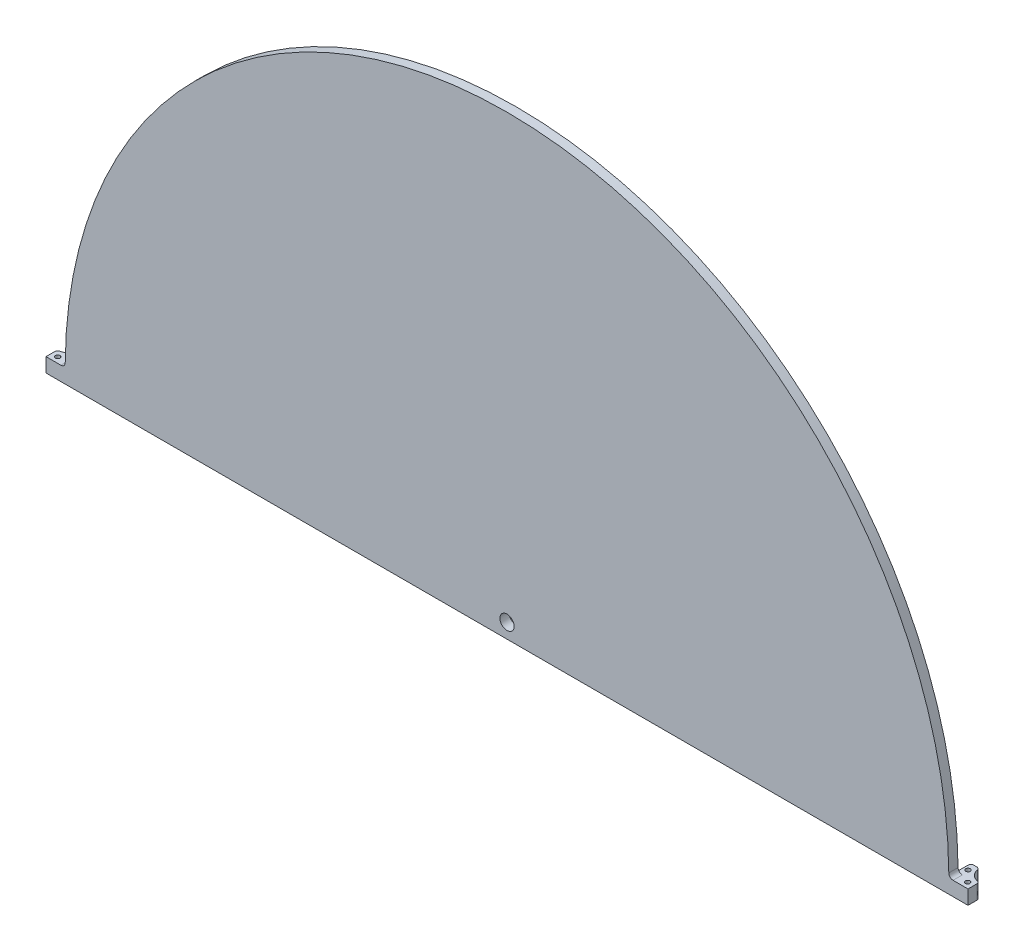
ISO-10303-21;
HEADER;
FILE_DESCRIPTION(('STEP AP214'),'2;1');
FILE_NAME('part.step','',(''),(''),'','','');
FILE_SCHEMA(('AUTOMOTIVE_DESIGN { 1 0 10303 214 1 1 1 1 }'));
ENDSEC;
DATA;
#1=APPLICATION_CONTEXT('core data for automotive mechanical design processes');
#2=APPLICATION_PROTOCOL_DEFINITION('international standard','automotive_design',2000,#1);
#3=PRODUCT_CONTEXT('',#1,'mechanical');
#4=PRODUCT('Part','Part','',(#3));
#5=PRODUCT_RELATED_PRODUCT_CATEGORY('part','',(#4));
#6=PRODUCT_DEFINITION_FORMATION('','',#4);
#7=PRODUCT_DEFINITION_CONTEXT('part definition',#1,'design');
#8=PRODUCT_DEFINITION('design','',#6,#7);
#9=PRODUCT_DEFINITION_SHAPE('','',#8);
#10=(LENGTH_UNIT() NAMED_UNIT(*) SI_UNIT(.MILLI.,.METRE.));
#11=(NAMED_UNIT(*) PLANE_ANGLE_UNIT() SI_UNIT($,.RADIAN.));
#12=(NAMED_UNIT(*) SI_UNIT($,.STERADIAN.) SOLID_ANGLE_UNIT());
#13=UNCERTAINTY_MEASURE_WITH_UNIT(LENGTH_MEASURE(1.E-05),#10,'distance_accuracy_value','');
#14=(GEOMETRIC_REPRESENTATION_CONTEXT(3) GLOBAL_UNCERTAINTY_ASSIGNED_CONTEXT((#13)) GLOBAL_UNIT_ASSIGNED_CONTEXT((#10,
#11,#12)) REPRESENTATION_CONTEXT('',''));
#15=CARTESIAN_POINT('',(0.,0.,0.));
#16=DIRECTION('',(0.,0.,1.));
#17=DIRECTION('',(1.,0.,0.));
#18=AXIS2_PLACEMENT_3D('',#15,#16,#17);
#19=CARTESIAN_POINT('',(376.100000000003,10.300000000002,-3.25));
#20=DIRECTION('',(0.,0.,-1.));
#21=DIRECTION('',(-1.,0.,0.));
#22=AXIS2_PLACEMENT_3D('',#19,#20,#21);
#23=PLANE('',#22);
#24=DIRECTION('',(0.,-1.,0.));
#25=VECTOR('',#24,1.);
#26=CARTESIAN_POINT('',(66.4999999999998,1.9802180162201E-12,-3.25));
#27=LINE('',#26,#25);
#28=CARTESIAN_POINT('',(66.4999999999998,12.000000000002,-3.25));
#29=VERTEX_POINT('',#28);
#30=CARTESIAN_POINT('',(66.4999999999998,1.97609092698544E-12,-3.25));
#31=VERTEX_POINT('',#30);
#32=EDGE_CURVE('E231',#29,#31,#27,.T.);
#33=ORIENTED_EDGE('',*,*,#32,.F.);
#34=DIRECTION('',(1.,0.,0.));
#35=VECTOR('',#34,1.);
#36=CARTESIAN_POINT('',(376.100000000003,12.0000000000018,-3.25));
#37=LINE('',#36,#35);
#38=CARTESIAN_POINT('',(65.3400504268845,12.000000000002,-3.25));
#39=VERTEX_POINT('',#38);
#40=EDGE_CURVE('E292',#29,#39,#37,.F.);
#41=ORIENTED_EDGE('',*,*,#40,.T.);
#42=CARTESIAN_POINT('',(62.5116233021383,13.000000000002,-3.25));
#43=DIRECTION('',(0.,0.,-1.));
#44=DIRECTION('',(-1.,0.,0.));
#45=AXIS2_PLACEMENT_3D('',#42,#43,#44);
#46=CIRCLE('',#45,3.);
#47=CARTESIAN_POINT('',(65.5115121098346,12.9741709183693,-3.25));
#48=VERTEX_POINT('',#47);
#49=EDGE_CURVE('E285',#39,#48,#46,.F.);
#50=ORIENTED_EDGE('',*,*,#49,.T.);
#51=CARTESIAN_POINT('',(376.100000000003,10.300000000002,-3.25));
#52=DIRECTION('',(0.,0.,1.));
#53=DIRECTION('',(-1.,0.,0.));
#54=AXIS2_PLACEMENT_3D('',#51,#52,#53);
#55=CIRCLE('',#54,310.600000000003);
#56=CARTESIAN_POINT('',(686.688487890172,12.9741709183693,-3.25));
#57=VERTEX_POINT('',#56);
#58=EDGE_CURVE('E207',#57,#48,#55,.T.);
#59=ORIENTED_EDGE('',*,*,#58,.F.);
#60=CARTESIAN_POINT('',(689.688376697868,13.000000000002,-3.25));
#61=DIRECTION('',(0.,0.,-1.));
#62=DIRECTION('',(-1.,0.,0.));
#63=AXIS2_PLACEMENT_3D('',#60,#61,#62);
#64=CIRCLE('',#63,3.);
#65=CARTESIAN_POINT('',(689.688376697868,10.000000000002,-3.25));
#66=VERTEX_POINT('',#65);
#67=EDGE_CURVE('E282',#57,#66,#64,.F.);
#68=ORIENTED_EDGE('',*,*,#67,.T.);
#69=DIRECTION('',(1.,0.,0.));
#70=VECTOR('',#69,1.);
#71=CARTESIAN_POINT('',(688.700000000006,10.000000000002,-3.25));
#72=LINE('',#71,#70);
#73=CARTESIAN_POINT('',(685.700000000006,10.000000000002,-3.25));
#74=VERTEX_POINT('',#73);
#75=EDGE_CURVE('E249',#74,#66,#72,.T.);
#76=ORIENTED_EDGE('',*,*,#75,.F.);
#77=DIRECTION('',(0.,1.,0.));
#78=VECTOR('',#77,1.);
#79=CARTESIAN_POINT('',(685.700000000006,1.97593175242309E-12,-3.25));
#80=LINE('',#79,#78);
#81=CARTESIAN_POINT('',(685.700000000006,2.07465181599142E-12,-3.25));
#82=VERTEX_POINT('',#81);
#83=EDGE_CURVE('E244',#82,#74,#80,.T.);
#84=ORIENTED_EDGE('',*,*,#83,.F.);
#85=DIRECTION('',(1.,0.,0.));
#86=VECTOR('',#85,1.);
#87=CARTESIAN_POINT('',(65.4999999999998,1.97593175242309E-12,-3.25));
#88=LINE('',#87,#86);
#89=EDGE_CURVE('E263',#31,#82,#88,.T.);
#90=ORIENTED_EDGE('',*,*,#89,.F.);
#91=EDGE_LOOP('',(#33,#41,#50,#59,#68,#76,#84,#90));
#92=FACE_BOUND('',#91,.T.);
#93=CARTESIAN_POINT('',(376.100000000003,10.300000000002,-3.25));
#94=DIRECTION('',(0.,0.,1.));
#95=DIRECTION('',(1.,0.,0.));
#96=AXIS2_PLACEMENT_3D('',#93,#94,#95);
#97=CIRCLE('',#96,4.99999999999999);
#98=CARTESIAN_POINT('',(371.100000000003,10.300000000002,-3.25));
#99=VERTEX_POINT('',#98);
#100=EDGE_CURVE('E259',#99,#99,#97,.T.);
#101=ORIENTED_EDGE('',*,*,#100,.T.);
#102=EDGE_LOOP('',(#101));
#103=FACE_BOUND('',#102,.T.);
#104=ADVANCED_FACE('F37',(#92,#103),#23,.T.);
#105=CARTESIAN_POINT('',(376.100000000003,10.300000000002,3.25));
#106=DIRECTION('',(0.,0.,-1.));
#107=DIRECTION('',(-1.,0.,0.));
#108=AXIS2_PLACEMENT_3D('',#105,#106,#107);
#109=PLANE('',#108);
#110=CARTESIAN_POINT('',(376.100000000003,10.300000000002,3.25));
#111=DIRECTION('',(0.,0.,1.));
#112=DIRECTION('',(-1.,0.,0.));
#113=AXIS2_PLACEMENT_3D('',#110,#111,#112);
#114=CIRCLE('',#113,310.600000000003);
#115=CARTESIAN_POINT('',(686.688487890172,12.9741709183693,3.25));
#116=VERTEX_POINT('',#115);
#117=CARTESIAN_POINT('',(65.5115121098346,12.9741709183693,3.25));
#118=VERTEX_POINT('',#117);
#119=EDGE_CURVE('E206',#116,#118,#114,.T.);
#120=ORIENTED_EDGE('',*,*,#119,.T.);
#121=CARTESIAN_POINT('',(62.5116233021383,13.000000000002,3.25));
#122=DIRECTION('',(0.,0.,-1.));
#123=DIRECTION('',(-1.,0.,0.));
#124=AXIS2_PLACEMENT_3D('',#121,#122,#123);
#125=CIRCLE('',#124,3.);
#126=CARTESIAN_POINT('',(62.5116233021383,10.000000000002,3.25));
#127=VERTEX_POINT('',#126);
#128=EDGE_CURVE('E287',#118,#127,#125,.T.);
#129=ORIENTED_EDGE('',*,*,#128,.T.);
#130=DIRECTION('',(1.,0.,0.));
#131=VECTOR('',#130,1.);
#132=CARTESIAN_POINT('',(65.4999999999998,10.000000000002,3.25));
#133=LINE('',#132,#131);
#134=CARTESIAN_POINT('',(51.9999999999998,10.000000000002,3.24999999999995));
#135=VERTEX_POINT('',#134);
#136=EDGE_CURVE('E228',#135,#127,#133,.T.);
#137=ORIENTED_EDGE('',*,*,#136,.F.);
#138=DIRECTION('',(0.,1.,0.));
#139=VECTOR('',#138,1.);
#140=CARTESIAN_POINT('',(51.9999999999998,0.,3.25));
#141=LINE('',#140,#139);
#142=CARTESIAN_POINT('',(51.9999999999998,0.,3.25));
#143=VERTEX_POINT('',#142);
#144=EDGE_CURVE('E205',#143,#135,#141,.T.);
#145=ORIENTED_EDGE('',*,*,#144,.F.);
#146=DIRECTION('',(1.,0.,0.));
#147=VECTOR('',#146,1.);
#148=CARTESIAN_POINT('',(65.4999999999998,1.97593175242309E-12,3.25));
#149=LINE('',#148,#147);
#150=CARTESIAN_POINT('',(700.200000000006,0.,3.25));
#151=VERTEX_POINT('',#150);
#152=EDGE_CURVE('E187',#143,#151,#149,.T.);
#153=ORIENTED_EDGE('',*,*,#152,.T.);
#154=DIRECTION('',(0.,1.,0.));
#155=VECTOR('',#154,1.);
#156=CARTESIAN_POINT('',(700.200000000006,0.,3.25));
#157=LINE('',#156,#155);
#158=CARTESIAN_POINT('',(700.200000000006,10.000000000002,3.24999999999995));
#159=VERTEX_POINT('',#158);
#160=EDGE_CURVE('E195',#151,#159,#157,.T.);
#161=ORIENTED_EDGE('',*,*,#160,.T.);
#162=DIRECTION('',(1.,0.,0.));
#163=VECTOR('',#162,1.);
#164=CARTESIAN_POINT('',(686.700000000006,10.0000000000016,3.25));
#165=LINE('',#164,#163);
#166=CARTESIAN_POINT('',(689.688376697868,10.0000000000016,3.25000000000005));
#167=VERTEX_POINT('',#166);
#168=EDGE_CURVE('E226',#167,#159,#165,.T.);
#169=ORIENTED_EDGE('',*,*,#168,.F.);
#170=CARTESIAN_POINT('',(689.688376697868,13.000000000002,3.25));
#171=DIRECTION('',(0.,0.,-1.));
#172=DIRECTION('',(-1.,0.,0.));
#173=AXIS2_PLACEMENT_3D('',#170,#171,#172);
#174=CIRCLE('',#173,3.);
#175=EDGE_CURVE('E280',#167,#116,#174,.T.);
#176=ORIENTED_EDGE('',*,*,#175,.T.);
#177=EDGE_LOOP('',(#120,#129,#137,#145,#153,#161,#169,#176));
#178=FACE_BOUND('',#177,.T.);
#179=CARTESIAN_POINT('',(376.100000000003,10.300000000002,3.25));
#180=DIRECTION('',(0.,0.,1.));
#181=DIRECTION('',(1.,0.,0.));
#182=AXIS2_PLACEMENT_3D('',#179,#180,#181);
#183=CIRCLE('',#182,4.99999999999999);
#184=CARTESIAN_POINT('',(371.100000000003,10.300000000002,3.25));
#185=VERTEX_POINT('',#184);
#186=EDGE_CURVE('E260',#185,#185,#183,.T.);
#187=ORIENTED_EDGE('',*,*,#186,.F.);
#188=EDGE_LOOP('',(#187));
#189=FACE_BOUND('',#188,.T.);
#190=ADVANCED_FACE('F200',(#178,#189),#109,.F.);
#191=CARTESIAN_POINT('',(65.4999999999998,1.97593175242309E-12,3.25));
#192=DIRECTION('',(0.,1.,0.));
#193=DIRECTION('',(-1.,0.,0.));
#194=AXIS2_PLACEMENT_3D('',#191,#192,#193);
#195=PLANE('',#194);
#196=CARTESIAN_POINT('',(688.700000000006,0.,-8.25));
#197=DIRECTION('',(0.,1.,0.));
#198=DIRECTION('',(0.,0.,-1.));
#199=AXIS2_PLACEMENT_3D('',#196,#197,#198);
#200=CIRCLE('',#199,1.60000000000001);
#201=CARTESIAN_POINT('',(688.700000000006,0.,-9.85000000000001));
#202=VERTEX_POINT('',#201);
#203=EDGE_CURVE('E727',#202,#202,#200,.T.);
#204=ORIENTED_EDGE('',*,*,#203,.T.);
#205=EDGE_LOOP('',(#204));
#206=FACE_BOUND('',#205,.T.);
#207=CARTESIAN_POINT('',(695.950000000006,0.,-0.750000000000002));
#208=DIRECTION('',(0.,1.,0.));
#209=DIRECTION('',(0.,0.,-1.));
#210=AXIS2_PLACEMENT_3D('',#207,#208,#209);
#211=CIRCLE('',#210,1.6);
#212=CARTESIAN_POINT('',(695.950000000006,0.,-2.35));
#213=VERTEX_POINT('',#212);
#214=EDGE_CURVE('E735',#213,#213,#211,.T.);
#215=ORIENTED_EDGE('',*,*,#214,.T.);
#216=EDGE_LOOP('',(#215));
#217=FACE_BOUND('',#216,.T.);
#218=CARTESIAN_POINT('',(63.4999999999998,0.,-8.25));
#219=DIRECTION('',(0.,-1.,0.));
#220=DIRECTION('',(0.,0.,-1.));
#221=AXIS2_PLACEMENT_3D('',#218,#219,#220);
#222=CIRCLE('',#221,1.60000000000001);
#223=CARTESIAN_POINT('',(63.4999999999998,0.,-9.85000000000001));
#224=VERTEX_POINT('',#223);
#225=EDGE_CURVE('E214',#224,#224,#222,.T.);
#226=ORIENTED_EDGE('',*,*,#225,.F.);
#227=EDGE_LOOP('',(#226));
#228=FACE_BOUND('',#227,.T.);
#229=CARTESIAN_POINT('',(56.2499999999998,0.,-0.750000000000002));
#230=DIRECTION('',(0.,-1.,0.));
#231=DIRECTION('',(0.,0.,-1.));
#232=AXIS2_PLACEMENT_3D('',#229,#230,#231);
#233=CIRCLE('',#232,1.6);
#234=CARTESIAN_POINT('',(56.2499999999998,0.,-2.35));
#235=VERTEX_POINT('',#234);
#236=EDGE_CURVE('E723',#235,#235,#233,.T.);
#237=ORIENTED_EDGE('',*,*,#236,.F.);
#238=EDGE_LOOP('',(#237));
#239=FACE_BOUND('',#238,.T.);
#240=DIRECTION('',(-1.,0.,0.));
#241=VECTOR('',#240,1.);
#242=CARTESIAN_POINT('',(688.700000000006,1.97593175242309E-12,-13.25));
#243=LINE('',#242,#241);
#244=CARTESIAN_POINT('',(689.892235935962,1.97593175242309E-12,-13.25));
#245=VERTEX_POINT('',#244);
#246=CARTESIAN_POINT('',(687.700000000006,1.97593175242309E-12,-13.25));
#247=VERTEX_POINT('',#246);
#248=EDGE_CURVE('E245',#245,#247,#243,.T.);
#249=ORIENTED_EDGE('',*,*,#248,.F.);
#250=CARTESIAN_POINT('',(689.892235935962,2.07819872422021E-12,-11.2499999999999));
#251=DIRECTION('',(0.,1.,0.));
#252=DIRECTION('',(-1.,0.,0.));
#253=AXIS2_PLACEMENT_3D('',#250,#251,#252);
#254=CIRCLE('',#253,2.);
#255=CARTESIAN_POINT('',(691.855619567209,2.07687051111676E-12,-11.6309523809523));
#256=VERTEX_POINT('',#255);
#257=EDGE_CURVE('E441',#245,#256,#254,.F.);
#258=ORIENTED_EDGE('',*,*,#257,.T.);
#259=CARTESIAN_POINT('',(700.200000000006,2.07819872422021E-12,-13.25));
#260=DIRECTION('',(0.,1.,0.));
#261=DIRECTION('',(-1.,0.,0.));
#262=AXIS2_PLACEMENT_3D('',#259,#260,#261);
#263=CIRCLE('',#262,8.5);
#264=CARTESIAN_POINT('',(698.580952380959,2.07794101302403E-12,-4.90561956720236));
#265=VERTEX_POINT('',#264);
#266=EDGE_CURVE('E459',#256,#265,#263,.T.);
#267=ORIENTED_EDGE('',*,*,#266,.T.);
#268=CARTESIAN_POINT('',(698.200000000006,2.07819872422021E-12,-2.94223593595585));
#269=DIRECTION('',(0.,1.,0.));
#270=DIRECTION('',(-1.,0.,0.));
#271=AXIS2_PLACEMENT_3D('',#268,#269,#270);
#272=CIRCLE('',#271,2.);
#273=CARTESIAN_POINT('',(700.200000000006,0.,-2.94223593595585));
#274=VERTEX_POINT('',#273);
#275=EDGE_CURVE('E190',#265,#274,#272,.F.);
#276=ORIENTED_EDGE('',*,*,#275,.T.);
#277=DIRECTION('',(0.,0.,1.));
#278=VECTOR('',#277,1.);
#279=CARTESIAN_POINT('',(700.200000000006,0.,3.25));
#280=LINE('',#279,#278);
#281=EDGE_CURVE('E182',#274,#151,#280,.T.);
#282=ORIENTED_EDGE('',*,*,#281,.T.);
#283=ORIENTED_EDGE('',*,*,#152,.F.);
#284=DIRECTION('',(0.,0.,1.));
#285=VECTOR('',#284,1.);
#286=CARTESIAN_POINT('',(51.9999999999998,0.,3.25));
#287=LINE('',#286,#285);
#288=CARTESIAN_POINT('',(51.9999999999998,0.,-2.94223593595585));
#289=VERTEX_POINT('',#288);
#290=EDGE_CURVE('E224',#289,#143,#287,.T.);
#291=ORIENTED_EDGE('',*,*,#290,.F.);
#292=CARTESIAN_POINT('',(53.9999999999998,1.97410124495608E-12,-2.94223593595585));
#293=DIRECTION('',(0.,1.,0.));
#294=DIRECTION('',(-1.,0.,0.));
#295=AXIS2_PLACEMENT_3D('',#292,#293,#294);
#296=CIRCLE('',#295,2.);
#297=CARTESIAN_POINT('',(53.6190476190475,1.97404060702757E-12,-4.90561956720235));
#298=VERTEX_POINT('',#297);
#299=EDGE_CURVE('E394',#289,#298,#296,.F.);
#300=ORIENTED_EDGE('',*,*,#299,.T.);
#301=CARTESIAN_POINT('',(51.9999999999998,1.97378289583139E-12,-13.25));
#302=DIRECTION('',(0.,1.,0.));
#303=DIRECTION('',(-1.,0.,0.));
#304=AXIS2_PLACEMENT_3D('',#301,#302,#303);
#305=CIRCLE('',#304,8.5);
#306=CARTESIAN_POINT('',(60.3443804327975,1.97511110893485E-12,-11.6309523809524));
#307=VERTEX_POINT('',#306);
#308=EDGE_CURVE('E305',#298,#307,#305,.T.);
#309=ORIENTED_EDGE('',*,*,#308,.T.);
#310=CARTESIAN_POINT('',(62.307764064044,1.97542362966507E-12,-11.25));
#311=DIRECTION('',(0.,1.,0.));
#312=DIRECTION('',(-1.,0.,0.));
#313=AXIS2_PLACEMENT_3D('',#310,#311,#312);
#314=CIRCLE('',#313,2.);
#315=CARTESIAN_POINT('',(62.307764064044,1.98124481788415E-12,-13.25));
#316=VERTEX_POINT('',#315);
#317=EDGE_CURVE('E397',#307,#316,#314,.F.);
#318=ORIENTED_EDGE('',*,*,#317,.T.);
#319=DIRECTION('',(-1.,0.,0.));
#320=VECTOR('',#319,1.);
#321=CARTESIAN_POINT('',(63.4999999999998,1.98095280429959E-12,-13.25));
#322=LINE('',#321,#320);
#323=CARTESIAN_POINT('',(64.4999999999998,1.98070787493976E-12,-13.25));
#324=VERTEX_POINT('',#323);
#325=EDGE_CURVE('E232',#324,#316,#322,.T.);
#326=ORIENTED_EDGE('',*,*,#325,.F.);
#327=CARTESIAN_POINT('',(64.4999999999998,1.97577257786074E-12,-11.25));
#328=DIRECTION('',(0.,1.,0.));
#329=DIRECTION('',(-1.,0.,0.));
#330=AXIS2_PLACEMENT_3D('',#327,#328,#329);
#331=CIRCLE('',#330,2.);
#332=CARTESIAN_POINT('',(66.4999999999998,1.9802180162201E-12,-11.25));
#333=VERTEX_POINT('',#332);
#334=EDGE_CURVE('E398',#324,#333,#331,.F.);
#335=ORIENTED_EDGE('',*,*,#334,.T.);
#336=DIRECTION('',(0.,0.,1.));
#337=VECTOR('',#336,1.);
#338=CARTESIAN_POINT('',(66.4999999999998,1.9802180162201E-12,-13.25));
#339=LINE('',#338,#337);
#340=EDGE_CURVE('E238',#333,#31,#339,.T.);
#341=ORIENTED_EDGE('',*,*,#340,.T.);
#342=ORIENTED_EDGE('',*,*,#89,.T.);
#343=DIRECTION('',(0.,0.,1.));
#344=VECTOR('',#343,1.);
#345=CARTESIAN_POINT('',(685.700000000006,1.97593175242309E-12,-13.25));
#346=LINE('',#345,#344);
#347=CARTESIAN_POINT('',(685.700000000006,1.97593175242309E-12,-11.25));
#348=VERTEX_POINT('',#347);
#349=EDGE_CURVE('E257',#348,#82,#346,.T.);
#350=ORIENTED_EDGE('',*,*,#349,.F.);
#351=CARTESIAN_POINT('',(687.700000000006,2.07497016511611E-12,-11.25));
#352=DIRECTION('',(0.,1.,0.));
#353=DIRECTION('',(-1.,0.,0.));
#354=AXIS2_PLACEMENT_3D('',#351,#352,#353);
#355=CIRCLE('',#354,2.);
#356=EDGE_CURVE('E429',#348,#247,#355,.F.);
#357=ORIENTED_EDGE('',*,*,#356,.T.);
#358=EDGE_LOOP('',(#249,#258,#267,#276,#282,#283,#291,#300,#309,#318,#326,#335,#341,#342,#350,#357));
#359=FACE_BOUND('',#358,.T.);
#360=ADVANCED_FACE('F185',(#206,#217,#228,#239,#359),#195,.F.);
#361=CARTESIAN_POINT('',(376.100000000003,10.300000000002,3.25));
#362=DIRECTION('',(0.,0.,-1.));
#363=DIRECTION('',(-1.,0.,0.));
#364=AXIS2_PLACEMENT_3D('',#361,#362,#363);
#365=CYLINDRICAL_SURFACE('',#364,310.600000000003);
#366=ORIENTED_EDGE('',*,*,#119,.F.);
#367=DIRECTION('',(0.,0.,-1.));
#368=VECTOR('',#367,1.);
#369=CARTESIAN_POINT('',(686.688487890172,12.9741709183693,3.25));
#370=LINE('',#369,#368);
#371=EDGE_CURVE('E276',#116,#57,#370,.T.);
#372=ORIENTED_EDGE('',*,*,#371,.T.);
#373=ORIENTED_EDGE('',*,*,#58,.T.);
#374=DIRECTION('',(0.,0.,-1.));
#375=VECTOR('',#374,1.);
#376=CARTESIAN_POINT('',(65.5115121098346,12.9741709183693,3.25));
#377=LINE('',#376,#375);
#378=EDGE_CURVE('E274',#48,#118,#377,.F.);
#379=ORIENTED_EDGE('',*,*,#378,.T.);
#380=EDGE_LOOP('',(#366,#372,#373,#379));
#381=FACE_BOUND('',#380,.T.);
#382=ADVANCED_FACE('F357',(#381),#365,.T.);
#383=CARTESIAN_POINT('',(376.100000000003,10.300000000002,3.25));
#384=DIRECTION('',(0.,0.,-1.));
#385=DIRECTION('',(-1.,0.,0.));
#386=AXIS2_PLACEMENT_3D('',#383,#384,#385);
#387=CYLINDRICAL_SURFACE('',#386,4.99999999999999);
#388=CARTESIAN_POINT('',(371.100000000003,10.300000000002,3.25));
#389=CARTESIAN_POINT('',(371.100000000003,10.300000000002,3.18229166666667));
#390=CARTESIAN_POINT('',(371.100000000003,10.300000000002,3.11458333333333));
#391=CARTESIAN_POINT('',(371.100000000003,10.300000000002,2.97916666666667));
#392=CARTESIAN_POINT('',(371.100000000003,10.300000000002,2.91145833333333));
#393=CARTESIAN_POINT('',(371.100000000003,10.300000000002,2.77604166666667));
#394=CARTESIAN_POINT('',(371.100000000003,10.300000000002,2.70833333333333));
#395=CARTESIAN_POINT('',(371.100000000003,10.300000000002,2.57291666666667));
#396=CARTESIAN_POINT('',(371.100000000003,10.300000000002,2.50520833333333));
#397=CARTESIAN_POINT('',(371.100000000003,10.300000000002,2.36979166666667));
#398=CARTESIAN_POINT('',(371.100000000003,10.300000000002,2.30208333333333));
#399=CARTESIAN_POINT('',(371.100000000003,10.300000000002,2.16666666666667));
#400=CARTESIAN_POINT('',(371.100000000003,10.300000000002,2.09895833333333));
#401=CARTESIAN_POINT('',(371.100000000003,10.300000000002,1.96354166666667));
#402=CARTESIAN_POINT('',(371.100000000003,10.300000000002,1.89583333333333));
#403=CARTESIAN_POINT('',(371.100000000003,10.300000000002,1.76041666666667));
#404=CARTESIAN_POINT('',(371.100000000003,10.300000000002,1.69270833333333));
#405=CARTESIAN_POINT('',(371.100000000003,10.300000000002,1.55729166666667));
#406=CARTESIAN_POINT('',(371.100000000003,10.300000000002,1.48958333333333));
#407=CARTESIAN_POINT('',(371.100000000003,10.300000000002,1.35416666666667));
#408=CARTESIAN_POINT('',(371.100000000003,10.300000000002,1.28645833333333));
#409=CARTESIAN_POINT('',(371.100000000003,10.300000000002,1.15104166666667));
#410=CARTESIAN_POINT('',(371.100000000003,10.300000000002,1.08333333333333));
#411=CARTESIAN_POINT('',(371.100000000003,10.300000000002,0.947916666666666));
#412=CARTESIAN_POINT('',(371.100000000003,10.300000000002,0.880208333333333));
#413=CARTESIAN_POINT('',(371.100000000003,10.300000000002,0.744791666666666));
#414=CARTESIAN_POINT('',(371.100000000003,10.300000000002,0.677083333333333));
#415=CARTESIAN_POINT('',(371.100000000003,10.300000000002,0.541666666666666));
#416=CARTESIAN_POINT('',(371.100000000003,10.300000000002,0.473958333333333));
#417=CARTESIAN_POINT('',(371.100000000003,10.300000000002,0.338541666666666));
#418=CARTESIAN_POINT('',(371.100000000003,10.300000000002,0.270833333333333));
#419=CARTESIAN_POINT('',(371.100000000003,10.300000000002,0.135416666666666));
#420=CARTESIAN_POINT('',(371.100000000003,10.300000000002,0.0677083333333329));
#421=CARTESIAN_POINT('',(371.100000000003,10.300000000002,-0.0677083333333338));
#422=CARTESIAN_POINT('',(371.100000000003,10.300000000002,-0.135416666666667));
#423=CARTESIAN_POINT('',(371.100000000003,10.300000000002,-0.270833333333334));
#424=CARTESIAN_POINT('',(371.100000000003,10.300000000002,-0.338541666666667));
#425=CARTESIAN_POINT('',(371.100000000003,10.300000000002,-0.473958333333334));
#426=CARTESIAN_POINT('',(371.100000000003,10.300000000002,-0.541666666666667));
#427=CARTESIAN_POINT('',(371.100000000003,10.300000000002,-0.677083333333333));
#428=CARTESIAN_POINT('',(371.100000000003,10.300000000002,-0.744791666666667));
#429=CARTESIAN_POINT('',(371.100000000003,10.300000000002,-0.880208333333333));
#430=CARTESIAN_POINT('',(371.100000000003,10.300000000002,-0.947916666666666));
#431=CARTESIAN_POINT('',(371.100000000003,10.300000000002,-1.08333333333333));
#432=CARTESIAN_POINT('',(371.100000000003,10.300000000002,-1.15104166666667));
#433=CARTESIAN_POINT('',(371.100000000003,10.300000000002,-1.28645833333333));
#434=CARTESIAN_POINT('',(371.100000000003,10.300000000002,-1.35416666666667));
#435=CARTESIAN_POINT('',(371.100000000003,10.300000000002,-1.48958333333333));
#436=CARTESIAN_POINT('',(371.100000000003,10.300000000002,-1.55729166666667));
#437=CARTESIAN_POINT('',(371.100000000003,10.300000000002,-1.69270833333333));
#438=CARTESIAN_POINT('',(371.100000000003,10.300000000002,-1.76041666666667));
#439=CARTESIAN_POINT('',(371.100000000003,10.300000000002,-1.89583333333333));
#440=CARTESIAN_POINT('',(371.100000000003,10.300000000002,-1.96354166666667));
#441=CARTESIAN_POINT('',(371.100000000003,10.300000000002,-2.09895833333333));
#442=CARTESIAN_POINT('',(371.100000000003,10.300000000002,-2.16666666666667));
#443=CARTESIAN_POINT('',(371.100000000003,10.300000000002,-2.30208333333333));
#444=CARTESIAN_POINT('',(371.100000000003,10.300000000002,-2.36979166666667));
#445=CARTESIAN_POINT('',(371.100000000003,10.300000000002,-2.50520833333333));
#446=CARTESIAN_POINT('',(371.100000000003,10.300000000002,-2.57291666666667));
#447=CARTESIAN_POINT('',(371.100000000003,10.300000000002,-2.70833333333333));
#448=CARTESIAN_POINT('',(371.100000000003,10.300000000002,-2.77604166666667));
#449=CARTESIAN_POINT('',(371.100000000003,10.300000000002,-2.91145833333333));
#450=CARTESIAN_POINT('',(371.100000000003,10.300000000002,-2.97916666666667));
#451=CARTESIAN_POINT('',(371.100000000003,10.300000000002,-3.11458333333333));
#452=CARTESIAN_POINT('',(371.100000000003,10.300000000002,-3.18229166666667));
#453=CARTESIAN_POINT('',(371.100000000003,10.300000000002,-3.25));
#454=B_SPLINE_CURVE_WITH_KNOTS('',3,(#388,#389,#390,#391,#392,#393,#394,#395,#396,#397,#398,
#399,#400,#401,#402,#403,#404,#405,#406,#407,#408,#409,#410,#411,#412,#413,#414,#415,#416,#417,
#418,#419,#420,#421,#422,#423,#424,#425,#426,#427,#428,#429,#430,#431,#432,#433,#434,#435,#436,
#437,#438,#439,#440,#441,#442,#443,#444,#445,#446,#447,#448,#449,#450,#451,#452,#453),
.UNSPECIFIED.,.F.,.F.,(4,2,2,2,2,2,2,2,2,2,2,2,2,2,2,2,2,2,2,2,2,2,2,2,2,2,2,2,2,2,2,2,4),(0.,
0.203125,0.40625,0.609375,0.8125,1.015625,1.21875,1.421875,1.625,1.828125,2.03125,2.234375,
2.4375,2.640625,2.84375,3.046875,3.25,3.453125,3.65625,3.859375,4.0625,4.265625,4.46875,
4.671875,4.875,5.078125,5.28125,5.484375,5.6875,5.890625,6.09375,6.296875,6.5),.UNSPECIFIED.);
#455=EDGE_CURVE('BSEAM360',#185,#99,#454,.T.);
#456=ORIENTED_EDGE('',*,*,#186,.T.);
#457=ORIENTED_EDGE('',*,*,#100,.F.);
#458=ORIENTED_EDGE('',*,*,#455,.T.);
#459=ORIENTED_EDGE('',*,*,#455,.F.);
#460=EDGE_LOOP('',(#456,#458,#457,#459));
#461=FACE_BOUND('',#460,.T.);
#462=ADVANCED_FACE('F360',(#461),#387,.F.);
#463=CARTESIAN_POINT('',(685.700000000006,1.97593175242309E-12,-13.25));
#464=DIRECTION('',(1.,0.,0.));
#465=DIRECTION('',(0.,0.,-1.));
#466=AXIS2_PLACEMENT_3D('',#463,#464,#465);
#467=PLANE('',#466);
#468=DIRECTION('',(0.,0.,1.));
#469=VECTOR('',#468,1.);
#470=CARTESIAN_POINT('',(685.700000000006,10.000000000002,-13.25));
#471=LINE('',#470,#469);
#472=CARTESIAN_POINT('',(685.700000000006,10.000000000002,-11.25));
#473=VERTEX_POINT('',#472);
#474=EDGE_CURVE('E252',#473,#74,#471,.T.);
#475=ORIENTED_EDGE('',*,*,#474,.F.);
#476=DIRECTION('',(0.,1.,0.));
#477=VECTOR('',#476,1.);
#478=CARTESIAN_POINT('',(685.700000000006,1.97593175242309E-12,-11.25));
#479=LINE('',#478,#477);
#480=EDGE_CURVE('E45',#473,#348,#479,.F.);
#481=ORIENTED_EDGE('',*,*,#480,.T.);
#482=ORIENTED_EDGE('',*,*,#349,.T.);
#483=ORIENTED_EDGE('',*,*,#83,.T.);
#484=EDGE_LOOP('',(#475,#481,#482,#483));
#485=FACE_BOUND('',#484,.T.);
#486=ADVANCED_FACE('F428',(#485),#467,.F.);
#487=CARTESIAN_POINT('',(688.700000000006,10.000000000002,-13.25));
#488=DIRECTION('',(0.,-1.,0.));
#489=DIRECTION('',(0.,0.,-1.));
#490=AXIS2_PLACEMENT_3D('',#487,#488,#489);
#491=PLANE('',#490);
#492=CARTESIAN_POINT('',(688.700000000006,10.0000000000016,-8.25));
#493=DIRECTION('',(0.,-1.,0.));
#494=DIRECTION('',(1.,0.,0.));
#495=AXIS2_PLACEMENT_3D('',#492,#493,#494);
#496=CIRCLE('',#495,1.60000000000001);
#497=CARTESIAN_POINT('',(690.300000000006,10.0000000000016,-8.25));
#498=VERTEX_POINT('',#497);
#499=EDGE_CURVE('E725',#498,#498,#496,.T.);
#500=ORIENTED_EDGE('',*,*,#499,.T.);
#501=EDGE_LOOP('',(#500));
#502=FACE_BOUND('',#501,.T.);
#503=CARTESIAN_POINT('',(695.950000000006,10.0000000000016,-0.750000000000002));
#504=DIRECTION('',(0.,-1.,0.));
#505=DIRECTION('',(1.,0.,0.));
#506=AXIS2_PLACEMENT_3D('',#503,#504,#505);
#507=CIRCLE('',#506,1.6);
#508=CARTESIAN_POINT('',(697.550000000006,10.0000000000016,-0.750000000000002));
#509=VERTEX_POINT('',#508);
#510=EDGE_CURVE('E732',#509,#509,#507,.T.);
#511=ORIENTED_EDGE('',*,*,#510,.T.);
#512=EDGE_LOOP('',(#511));
#513=FACE_BOUND('',#512,.T.);
#514=CARTESIAN_POINT('',(700.200000000006,10.000000000002,-13.2500000000001));
#515=DIRECTION('',(0.,-1.,0.));
#516=DIRECTION('',(0.,0.,-1.));
#517=AXIS2_PLACEMENT_3D('',#514,#515,#516);
#518=CIRCLE('',#517,8.5);
#519=CARTESIAN_POINT('',(698.580952380959,10.000000000002,-4.90561956720241));
#520=VERTEX_POINT('',#519);
#521=CARTESIAN_POINT('',(691.855619567209,10.000000000002,-11.6309523809523));
#522=VERTEX_POINT('',#521);
#523=EDGE_CURVE('E457',#520,#522,#518,.T.);
#524=ORIENTED_EDGE('',*,*,#523,.T.);
#525=CARTESIAN_POINT('',(689.892235935962,10.000000000002,-11.2499999999999));
#526=DIRECTION('',(0.,-1.,0.));
#527=DIRECTION('',(0.,0.,-1.));
#528=AXIS2_PLACEMENT_3D('',#525,#526,#527);
#529=CIRCLE('',#528,2.);
#530=CARTESIAN_POINT('',(689.892235935962,10.000000000002,-13.25));
#531=VERTEX_POINT('',#530);
#532=EDGE_CURVE('E406',#522,#531,#529,.F.);
#533=ORIENTED_EDGE('',*,*,#532,.T.);
#534=DIRECTION('',(1.,0.,0.));
#535=VECTOR('',#534,1.);
#536=CARTESIAN_POINT('',(688.700000000006,10.000000000002,-13.25));
#537=LINE('',#536,#535);
#538=CARTESIAN_POINT('',(687.700000000006,10.000000000002,-13.25));
#539=VERTEX_POINT('',#538);
#540=EDGE_CURVE('E248',#539,#531,#537,.T.);
#541=ORIENTED_EDGE('',*,*,#540,.F.);
#542=CARTESIAN_POINT('',(687.700000000006,10.000000000002,-11.25));
#543=DIRECTION('',(0.,-1.,0.));
#544=DIRECTION('',(0.,0.,-1.));
#545=AXIS2_PLACEMENT_3D('',#542,#543,#544);
#546=CIRCLE('',#545,2.);
#547=EDGE_CURVE('E410',#539,#473,#546,.F.);
#548=ORIENTED_EDGE('',*,*,#547,.T.);
#549=ORIENTED_EDGE('',*,*,#474,.T.);
#550=ORIENTED_EDGE('',*,*,#75,.T.);
#551=DIRECTION('',(0.,0.,1.));
#552=VECTOR('',#551,1.);
#553=CARTESIAN_POINT('',(689.688376697868,10.000000000002,3.25));
#554=LINE('',#553,#552);
#555=EDGE_CURVE('E267',#66,#167,#554,.T.);
#556=ORIENTED_EDGE('',*,*,#555,.T.);
#557=ORIENTED_EDGE('',*,*,#168,.T.);
#558=DIRECTION('',(0.,0.,-1.));
#559=VECTOR('',#558,1.);
#560=CARTESIAN_POINT('',(700.200000000006,10.000000000002,3.24999999999995));
#561=LINE('',#560,#559);
#562=CARTESIAN_POINT('',(700.200000000006,10.000000000002,-2.9422359359559));
#563=VERTEX_POINT('',#562);
#564=EDGE_CURVE('E194',#159,#563,#561,.T.);
#565=ORIENTED_EDGE('',*,*,#564,.T.);
#566=CARTESIAN_POINT('',(698.200000000006,10.000000000002,-2.9422359359559));
#567=DIRECTION('',(0.,-1.,0.));
#568=DIRECTION('',(0.,0.,-1.));
#569=AXIS2_PLACEMENT_3D('',#566,#567,#568);
#570=CIRCLE('',#569,2.);
#571=EDGE_CURVE('E448',#563,#520,#570,.F.);
#572=ORIENTED_EDGE('',*,*,#571,.T.);
#573=EDGE_LOOP('',(#524,#533,#541,#548,#549,#550,#556,#557,#565,#572));
#574=FACE_BOUND('',#573,.T.);
#575=ADVANCED_FACE('F452',(#502,#513,#574),#491,.F.);
#576=CARTESIAN_POINT('',(0.,0.,-13.25));
#577=DIRECTION('',(0.,0.,1.));
#578=DIRECTION('',(1.,0.,0.));
#579=AXIS2_PLACEMENT_3D('',#576,#577,#578);
#580=PLANE('',#579);
#581=ORIENTED_EDGE('',*,*,#540,.T.);
#582=DIRECTION('',(0.,1.,0.));
#583=VECTOR('',#582,1.);
#584=CARTESIAN_POINT('',(689.892235935962,0.,-13.25));
#585=LINE('',#584,#583);
#586=EDGE_CURVE('E436',#531,#245,#585,.F.);
#587=ORIENTED_EDGE('',*,*,#586,.T.);
#588=ORIENTED_EDGE('',*,*,#248,.T.);
#589=DIRECTION('',(0.,1.,0.));
#590=VECTOR('',#589,1.);
#591=CARTESIAN_POINT('',(687.700000000006,0.,-13.25));
#592=LINE('',#591,#590);
#593=EDGE_CURVE('E433',#247,#539,#592,.T.);
#594=ORIENTED_EDGE('',*,*,#593,.T.);
#595=EDGE_LOOP('',(#581,#587,#588,#594));
#596=FACE_BOUND('',#595,.T.);
#597=ADVANCED_FACE('F454',(#596),#580,.F.);
#598=CARTESIAN_POINT('',(63.4999999999998,10.000000000002,-13.25));
#599=DIRECTION('',(0.,-1.,0.));
#600=DIRECTION('',(1.,0.,0.));
#601=AXIS2_PLACEMENT_3D('',#598,#599,#600);
#602=PLANE('',#601);
#603=CARTESIAN_POINT('',(63.4999999999998,10.000000000002,-8.25));
#604=DIRECTION('',(0.,-1.,0.));
#605=DIRECTION('',(1.,0.,0.));
#606=AXIS2_PLACEMENT_3D('',#603,#604,#605);
#607=CIRCLE('',#606,1.60000000000001);
#608=CARTESIAN_POINT('',(65.0999999999998,10.000000000002,-8.25));
#609=VERTEX_POINT('',#608);
#610=EDGE_CURVE('E211',#609,#609,#607,.F.);
#611=ORIENTED_EDGE('',*,*,#610,.F.);
#612=EDGE_LOOP('',(#611));
#613=FACE_BOUND('',#612,.T.);
#614=CARTESIAN_POINT('',(56.2499999999998,10.000000000002,-0.750000000000002));
#615=DIRECTION('',(0.,-1.,0.));
#616=DIRECTION('',(1.,0.,0.));
#617=AXIS2_PLACEMENT_3D('',#614,#615,#616);
#618=CIRCLE('',#617,1.6);
#619=CARTESIAN_POINT('',(57.8499999999998,10.000000000002,-0.750000000000002));
#620=VERTEX_POINT('',#619);
#621=EDGE_CURVE('E217',#620,#620,#618,.F.);
#622=ORIENTED_EDGE('',*,*,#621,.F.);
#623=EDGE_LOOP('',(#622));
#624=FACE_BOUND('',#623,.T.);
#625=DIRECTION('',(1.,0.,0.));
#626=VECTOR('',#625,1.);
#627=CARTESIAN_POINT('',(63.4999999999998,10.000000000002,-13.25));
#628=LINE('',#627,#626);
#629=CARTESIAN_POINT('',(62.307764064044,10.000000000002,-13.25));
#630=VERTEX_POINT('',#629);
#631=CARTESIAN_POINT('',(64.4999999999998,10.000000000002,-13.25));
#632=VERTEX_POINT('',#631);
#633=EDGE_CURVE('E235',#630,#632,#628,.T.);
#634=ORIENTED_EDGE('',*,*,#633,.F.);
#635=CARTESIAN_POINT('',(62.307764064044,10.000000000002,-11.2500000000001));
#636=DIRECTION('',(0.,-1.,0.));
#637=DIRECTION('',(1.,0.,0.));
#638=AXIS2_PLACEMENT_3D('',#635,#636,#637);
#639=CIRCLE('',#638,2.);
#640=CARTESIAN_POINT('',(60.3443804327975,10.000000000002,-11.6309523809524));
#641=VERTEX_POINT('',#640);
#642=EDGE_CURVE('E421',#630,#641,#639,.F.);
#643=ORIENTED_EDGE('',*,*,#642,.T.);
#644=CARTESIAN_POINT('',(51.9999999999998,10.000000000002,-13.2500000000001));
#645=DIRECTION('',(0.,-1.,0.));
#646=DIRECTION('',(1.,0.,0.));
#647=AXIS2_PLACEMENT_3D('',#644,#645,#646);
#648=CIRCLE('',#647,8.5);
#649=CARTESIAN_POINT('',(53.6190476190475,10.000000000002,-4.90561956720241));
#650=VERTEX_POINT('',#649);
#651=EDGE_CURVE('E405',#641,#650,#648,.T.);
#652=ORIENTED_EDGE('',*,*,#651,.T.);
#653=CARTESIAN_POINT('',(53.9999999999998,10.000000000002,-2.9422359359559));
#654=DIRECTION('',(0.,-1.,0.));
#655=DIRECTION('',(1.,0.,0.));
#656=AXIS2_PLACEMENT_3D('',#653,#654,#655);
#657=CIRCLE('',#656,2.);
#658=CARTESIAN_POINT('',(51.9999999999998,10.000000000002,-2.9422359359559));
#659=VERTEX_POINT('',#658);
#660=EDGE_CURVE('E52',#650,#659,#657,.F.);
#661=ORIENTED_EDGE('',*,*,#660,.T.);
#662=DIRECTION('',(0.,0.,-1.));
#663=VECTOR('',#662,1.);
#664=CARTESIAN_POINT('',(51.9999999999998,10.000000000002,3.24999999999995));
#665=LINE('',#664,#663);
#666=EDGE_CURVE('E222',#135,#659,#665,.T.);
#667=ORIENTED_EDGE('',*,*,#666,.F.);
#668=ORIENTED_EDGE('',*,*,#136,.T.);
#669=DIRECTION('',(0.,0.,1.));
#670=VECTOR('',#669,1.);
#671=CARTESIAN_POINT('',(62.5116233021383,10.000000000002,-3.25));
#672=LINE('',#671,#670);
#673=CARTESIAN_POINT('',(62.5116233021383,10.000000000002,-5.25));
#674=VERTEX_POINT('',#673);
#675=EDGE_CURVE('E278',#127,#674,#672,.F.);
#676=ORIENTED_EDGE('',*,*,#675,.T.);
#677=DIRECTION('',(1.,0.,0.));
#678=VECTOR('',#677,1.);
#679=CARTESIAN_POINT('',(63.4999999999998,10.000000000002,-5.25));
#680=LINE('',#679,#678);
#681=CARTESIAN_POINT('',(66.4999999999998,10.000000000002,-5.25));
#682=VERTEX_POINT('',#681);
#683=EDGE_CURVE('E289',#674,#682,#680,.T.);
#684=ORIENTED_EDGE('',*,*,#683,.T.);
#685=DIRECTION('',(0.,0.,1.));
#686=VECTOR('',#685,1.);
#687=CARTESIAN_POINT('',(66.4999999999998,10.000000000002,-13.25));
#688=LINE('',#687,#686);
#689=CARTESIAN_POINT('',(66.4999999999998,10.000000000002,-11.25));
#690=VERTEX_POINT('',#689);
#691=EDGE_CURVE('E242',#690,#682,#688,.T.);
#692=ORIENTED_EDGE('',*,*,#691,.F.);
#693=CARTESIAN_POINT('',(64.4999999999998,10.000000000002,-11.25));
#694=DIRECTION('',(0.,-1.,0.));
#695=DIRECTION('',(1.,0.,0.));
#696=AXIS2_PLACEMENT_3D('',#693,#694,#695);
#697=CIRCLE('',#696,2.);
#698=EDGE_CURVE('E418',#690,#632,#697,.F.);
#699=ORIENTED_EDGE('',*,*,#698,.T.);
#700=EDGE_LOOP('',(#634,#643,#652,#661,#667,#668,#676,#684,#692,#699));
#701=FACE_BOUND('',#700,.T.);
#702=ADVANCED_FACE('F388',(#613,#624,#701),#602,.F.);
#703=CARTESIAN_POINT('',(66.4999999999998,1.9802180162201E-12,-13.25));
#704=DIRECTION('',(-1.,0.,0.));
#705=DIRECTION('',(0.,0.,1.));
#706=AXIS2_PLACEMENT_3D('',#703,#704,#705);
#707=PLANE('',#706);
#708=ORIENTED_EDGE('',*,*,#340,.F.);
#709=DIRECTION('',(0.,-1.,0.));
#710=VECTOR('',#709,1.);
#711=CARTESIAN_POINT('',(66.4999999999998,1.9802180162201E-12,-11.25));
#712=LINE('',#711,#710);
#713=EDGE_CURVE('E60',#333,#690,#712,.F.);
#714=ORIENTED_EDGE('',*,*,#713,.T.);
#715=ORIENTED_EDGE('',*,*,#691,.T.);
#716=CARTESIAN_POINT('',(66.4999999999998,12.000000000002,-5.25));
#717=DIRECTION('',(-1.,0.,0.));
#718=DIRECTION('',(0.,0.,1.));
#719=AXIS2_PLACEMENT_3D('',#716,#717,#718);
#720=CIRCLE('',#719,2.);
#721=EDGE_CURVE('E294',#682,#29,#720,.T.);
#722=ORIENTED_EDGE('',*,*,#721,.T.);
#723=ORIENTED_EDGE('',*,*,#32,.T.);
#724=EDGE_LOOP('',(#708,#714,#715,#722,#723));
#725=FACE_BOUND('',#724,.T.);
#726=ADVANCED_FACE('F469',(#725),#707,.F.);
#727=CARTESIAN_POINT('',(0.,0.,-13.25));
#728=DIRECTION('',(0.,0.,1.));
#729=DIRECTION('',(1.,0.,0.));
#730=AXIS2_PLACEMENT_3D('',#727,#728,#729);
#731=PLANE('',#730);
#732=ORIENTED_EDGE('',*,*,#325,.T.);
#733=DIRECTION('',(0.,-1.,0.));
#734=VECTOR('',#733,1.);
#735=CARTESIAN_POINT('',(62.307764064044,0.,-13.25));
#736=LINE('',#735,#734);
#737=EDGE_CURVE('E416',#316,#630,#736,.F.);
#738=ORIENTED_EDGE('',*,*,#737,.T.);
#739=ORIENTED_EDGE('',*,*,#633,.T.);
#740=DIRECTION('',(0.,-1.,0.));
#741=VECTOR('',#740,1.);
#742=CARTESIAN_POINT('',(64.4999999999998,0.,-13.25));
#743=LINE('',#742,#741);
#744=EDGE_CURVE('E408',#632,#324,#743,.T.);
#745=ORIENTED_EDGE('',*,*,#744,.T.);
#746=EDGE_LOOP('',(#732,#738,#739,#745));
#747=FACE_BOUND('',#746,.T.);
#748=ADVANCED_FACE('F466',(#747),#731,.F.);
#749=CARTESIAN_POINT('',(51.9999999999998,0.,0.));
#750=DIRECTION('',(-1.,0.,0.));
#751=DIRECTION('',(0.,0.,1.));
#752=AXIS2_PLACEMENT_3D('',#749,#750,#751);
#753=PLANE('',#752);
#754=ORIENTED_EDGE('',*,*,#666,.T.);
#755=DIRECTION('',(0.,1.,0.));
#756=VECTOR('',#755,1.);
#757=CARTESIAN_POINT('',(51.9999999999998,0.,-2.94223593595585));
#758=LINE('',#757,#756);
#759=EDGE_CURVE('E392',#659,#289,#758,.F.);
#760=ORIENTED_EDGE('',*,*,#759,.T.);
#761=ORIENTED_EDGE('',*,*,#290,.T.);
#762=ORIENTED_EDGE('',*,*,#144,.T.);
#763=EDGE_LOOP('',(#754,#760,#761,#762));
#764=FACE_BOUND('',#763,.T.);
#765=ADVANCED_FACE('F373',(#764),#753,.T.);
#766=CARTESIAN_POINT('',(700.200000000006,0.,0.));
#767=DIRECTION('',(1.,0.,0.));
#768=DIRECTION('',(0.,0.,1.));
#769=AXIS2_PLACEMENT_3D('',#766,#767,#768);
#770=PLANE('',#769);
#771=ORIENTED_EDGE('',*,*,#281,.F.);
#772=DIRECTION('',(0.,-1.,0.));
#773=VECTOR('',#772,1.);
#774=CARTESIAN_POINT('',(700.200000000006,10.000000000002,-2.9422359359559));
#775=LINE('',#774,#773);
#776=EDGE_CURVE('E11',#274,#563,#775,.F.);
#777=ORIENTED_EDGE('',*,*,#776,.T.);
#778=ORIENTED_EDGE('',*,*,#564,.F.);
#779=ORIENTED_EDGE('',*,*,#160,.F.);
#780=EDGE_LOOP('',(#771,#777,#778,#779));
#781=FACE_BOUND('',#780,.T.);
#782=ADVANCED_FACE('F209',(#781),#770,.T.);
#783=CARTESIAN_POINT('',(689.688376697868,13.000000000002,3.25));
#784=DIRECTION('',(0.,0.,-1.));
#785=DIRECTION('',(-1.,0.,0.));
#786=AXIS2_PLACEMENT_3D('',#783,#784,#785);
#787=CYLINDRICAL_SURFACE('',#786,3.);
#788=ORIENTED_EDGE('',*,*,#67,.F.);
#789=ORIENTED_EDGE('',*,*,#371,.F.);
#790=ORIENTED_EDGE('',*,*,#175,.F.);
#791=ORIENTED_EDGE('',*,*,#555,.F.);
#792=EDGE_LOOP('',(#788,#789,#790,#791));
#793=FACE_BOUND('',#792,.T.);
#794=ADVANCED_FACE('F364',(#793),#787,.F.);
#795=CARTESIAN_POINT('',(62.5116233021383,13.000000000002,3.25));
#796=DIRECTION('',(0.,0.,-1.));
#797=DIRECTION('',(-1.,0.,0.));
#798=AXIS2_PLACEMENT_3D('',#795,#796,#797);
#799=CYLINDRICAL_SURFACE('',#798,3.);
#800=ORIENTED_EDGE('',*,*,#128,.F.);
#801=ORIENTED_EDGE('',*,*,#378,.F.);
#802=ORIENTED_EDGE('',*,*,#49,.F.);
#803=CARTESIAN_POINT('',(65.3400504268845,12.000000000002,-3.25));
#804=CARTESIAN_POINT('',(65.3201303524071,11.9436159444494,-3.24999155503509));
#805=CARTESIAN_POINT('',(65.2985102751863,11.8878690947605,-3.25238347095707));
#806=CARTESIAN_POINT('',(65.2521705143579,11.778149027861,-3.26158389686028));
#807=CARTESIAN_POINT('',(65.227455623453,11.724173227645,-3.26838564428017));
#808=CARTESIAN_POINT('',(65.1754276266808,11.6188529678967,-3.2859349910355));
#809=CARTESIAN_POINT('',(65.1481432245129,11.5674874674904,-3.29664212178408));
#810=CARTESIAN_POINT('',(65.091053220947,11.4670669910123,-3.32161665691399));
#811=CARTESIAN_POINT('',(65.0612464361053,11.4180131164939,-3.33588573867057));
#812=CARTESIAN_POINT('',(64.9543880973316,11.2528931537772,-3.39067309364308));
#813=CARTESIAN_POINT('',(64.8716326108685,11.1430488576861,-3.43920087639875));
#814=CARTESIAN_POINT('',(64.6960951187934,10.939338038275,-3.55042012910899));
#815=CARTESIAN_POINT('',(64.6032696885755,10.8455456046749,-3.61317432497027));
#816=CARTESIAN_POINT('',(64.3733156987922,10.6407427963716,-3.77506668300536));
#817=CARTESIAN_POINT('',(64.232937460201,10.5371027212925,-3.87888978797452));
#818=CARTESIAN_POINT('',(63.943845011597,10.3584666820672,-4.0987084279434));
#819=CARTESIAN_POINT('',(63.7951194257754,10.2835109521083,-4.21472077181734));
#820=CARTESIAN_POINT('',(63.5525095797888,10.184633309679,-4.40675807252234));
#821=CARTESIAN_POINT('',(63.4601463865462,10.1522452036392,-4.48049496647784));
#822=CARTESIAN_POINT('',(63.2741360910927,10.0968977952418,-4.629874952477));
#823=CARTESIAN_POINT('',(63.1804885751955,10.0739416083387,-4.70551866561908));
#824=CARTESIAN_POINT('',(62.8987330515995,10.0189448512718,-4.93393402433989));
#825=CARTESIAN_POINT('',(62.7092349762462,10.0005465936679,-5.08865085771955));
#826=CARTESIAN_POINT('',(62.517280071898,10.0000040048208,-5.24538126864284));
#827=CARTESIAN_POINT('',(62.5144516417222,10.0000000052173,-5.24769067225487));
#828=CARTESIAN_POINT('',(62.5116233021383,10.000000000002,-5.25));
#829=B_SPLINE_CURVE_WITH_KNOTS('',3,(#803,#804,#805,#806,#807,#808,#809,#810,#811,#812,#813,
#814,#815,#816,#817,#818,#819,#820,#821,#822,#823,#824,#825,#826,#827,#828),.UNSPECIFIED.,.F.,
.F.,(4,2,2,2,2,2,2,2,2,2,2,2,4),(0.,0.179272158824203,0.358270048541682,0.535463494925236,
0.712740542250157,1.14766579663327,1.58454732757418,2.19039501983584,2.79708941843103,
3.16434808038175,3.53172795410128,4.26418943717292,4.2751438948957),.UNSPECIFIED.);
#830=EDGE_CURVE('E297',#39,#674,#829,.T.);
#831=ORIENTED_EDGE('',*,*,#830,.T.);
#832=ORIENTED_EDGE('',*,*,#675,.F.);
#833=EDGE_LOOP('',(#800,#801,#802,#831,#832));
#834=FACE_BOUND('',#833,.T.);
#835=ADVANCED_FACE('F307',(#834),#799,.F.);
#836=CARTESIAN_POINT('',(56.2499999999998,14.5254833995959,-0.750000000000002));
#837=DIRECTION('',(0.,-1.,0.));
#838=DIRECTION('',(0.,0.,-1.));
#839=AXIS2_PLACEMENT_3D('',#836,#837,#838);
#840=CYLINDRICAL_SURFACE('',#839,1.6);
#841=ORIENTED_EDGE('',*,*,#621,.T.);
#842=EDGE_LOOP('',(#841));
#843=FACE_BOUND('',#842,.T.);
#844=ORIENTED_EDGE('',*,*,#236,.T.);
#845=EDGE_LOOP('',(#844));
#846=FACE_BOUND('',#845,.T.);
#847=ADVANCED_FACE('F371',(#843,#846),#840,.F.);
#848=CARTESIAN_POINT('',(63.4999999999998,14.5254833995959,-8.25));
#849=DIRECTION('',(0.,-1.,0.));
#850=DIRECTION('',(0.,0.,-1.));
#851=AXIS2_PLACEMENT_3D('',#848,#849,#850);
#852=CYLINDRICAL_SURFACE('',#851,1.60000000000001);
#853=ORIENTED_EDGE('',*,*,#610,.T.);
#854=EDGE_LOOP('',(#853));
#855=FACE_BOUND('',#854,.T.);
#856=ORIENTED_EDGE('',*,*,#225,.T.);
#857=EDGE_LOOP('',(#856));
#858=FACE_BOUND('',#857,.T.);
#859=ADVANCED_FACE('F614',(#855,#858),#852,.F.);
#860=CARTESIAN_POINT('',(695.950000000006,14.5254833995956,-0.750000000000002));
#861=DIRECTION('',(0.,-1.,0.));
#862=DIRECTION('',(0.,0.,-1.));
#863=AXIS2_PLACEMENT_3D('',#860,#861,#862);
#864=CYLINDRICAL_SURFACE('',#863,1.6);
#865=ORIENTED_EDGE('',*,*,#510,.F.);
#866=EDGE_LOOP('',(#865));
#867=FACE_BOUND('',#866,.T.);
#868=ORIENTED_EDGE('',*,*,#214,.F.);
#869=EDGE_LOOP('',(#868));
#870=FACE_BOUND('',#869,.T.);
#871=ADVANCED_FACE('F606',(#867,#870),#864,.F.);
#872=CARTESIAN_POINT('',(688.700000000006,14.5254833995956,-8.25));
#873=DIRECTION('',(0.,-1.,0.));
#874=DIRECTION('',(0.,0.,-1.));
#875=AXIS2_PLACEMENT_3D('',#872,#873,#874);
#876=CYLINDRICAL_SURFACE('',#875,1.60000000000001);
#877=ORIENTED_EDGE('',*,*,#499,.F.);
#878=EDGE_LOOP('',(#877));
#879=FACE_BOUND('',#878,.T.);
#880=ORIENTED_EDGE('',*,*,#203,.F.);
#881=EDGE_LOOP('',(#880));
#882=FACE_BOUND('',#881,.T.);
#883=ADVANCED_FACE('F315',(#879,#882),#876,.F.);
#884=CARTESIAN_POINT('',(63.4999999999998,12.000000000002,-5.25));
#885=DIRECTION('',(1.,0.,0.));
#886=DIRECTION('',(0.,1.,0.));
#887=AXIS2_PLACEMENT_3D('',#884,#885,#886);
#888=CYLINDRICAL_SURFACE('',#887,2.);
#889=ORIENTED_EDGE('',*,*,#830,.F.);
#890=ORIENTED_EDGE('',*,*,#40,.F.);
#891=ORIENTED_EDGE('',*,*,#721,.F.);
#892=ORIENTED_EDGE('',*,*,#683,.F.);
#893=EDGE_LOOP('',(#889,#890,#891,#892));
#894=FACE_BOUND('',#893,.T.);
#895=ADVANCED_FACE('F310',(#894),#888,.F.);
#896=CARTESIAN_POINT('',(51.9999999999998,0.,-13.25));
#897=DIRECTION('',(0.,-1.,0.));
#898=DIRECTION('',(0.,0.,-1.));
#899=AXIS2_PLACEMENT_3D('',#896,#897,#898);
#900=CYLINDRICAL_SURFACE('',#899,8.5);
#901=ORIENTED_EDGE('',*,*,#651,.F.);
#902=DIRECTION('',(0.,-1.,0.));
#903=VECTOR('',#902,1.);
#904=CARTESIAN_POINT('',(60.3443804327975,0.,-11.6309523809524));
#905=LINE('',#904,#903);
#906=EDGE_CURVE('E404',#641,#307,#905,.T.);
#907=ORIENTED_EDGE('',*,*,#906,.T.);
#908=ORIENTED_EDGE('',*,*,#308,.F.);
#909=DIRECTION('',(0.,-1.,0.));
#910=VECTOR('',#909,1.);
#911=CARTESIAN_POINT('',(53.6190476190475,0.,-4.90561956720235));
#912=LINE('',#911,#910);
#913=EDGE_CURVE('E402',#298,#650,#912,.F.);
#914=ORIENTED_EDGE('',*,*,#913,.T.);
#915=EDGE_LOOP('',(#901,#907,#908,#914));
#916=FACE_BOUND('',#915,.T.);
#917=ADVANCED_FACE('F314',(#916),#900,.F.);
#918=CARTESIAN_POINT('',(700.200000000006,27.2409396495687,-13.2500000000001));
#919=DIRECTION('',(0.,1.,0.));
#920=DIRECTION('',(0.,0.,1.));
#921=AXIS2_PLACEMENT_3D('',#918,#919,#920);
#922=CYLINDRICAL_SURFACE('',#921,8.5);
#923=ORIENTED_EDGE('',*,*,#266,.F.);
#924=DIRECTION('',(0.,1.,0.));
#925=VECTOR('',#924,1.);
#926=CARTESIAN_POINT('',(691.855619567209,27.2409396495687,-11.6309523809524));
#927=LINE('',#926,#925);
#928=EDGE_CURVE('E446',#256,#522,#927,.T.);
#929=ORIENTED_EDGE('',*,*,#928,.T.);
#930=ORIENTED_EDGE('',*,*,#523,.F.);
#931=DIRECTION('',(0.,1.,0.));
#932=VECTOR('',#931,1.);
#933=CARTESIAN_POINT('',(698.580952380959,27.2409396495687,-4.9056195672025));
#934=LINE('',#933,#932);
#935=EDGE_CURVE('E443',#520,#265,#934,.F.);
#936=ORIENTED_EDGE('',*,*,#935,.T.);
#937=EDGE_LOOP('',(#923,#929,#930,#936));
#938=FACE_BOUND('',#937,.T.);
#939=ADVANCED_FACE('F319',(#938),#922,.F.);
#940=CARTESIAN_POINT('',(689.892235935962,27.2409396495687,-11.25));
#941=DIRECTION('',(0.,1.,0.));
#942=DIRECTION('',(0.,0.,1.));
#943=AXIS2_PLACEMENT_3D('',#940,#941,#942);
#944=CYLINDRICAL_SURFACE('',#943,2.);
#945=ORIENTED_EDGE('',*,*,#532,.F.);
#946=ORIENTED_EDGE('',*,*,#928,.F.);
#947=ORIENTED_EDGE('',*,*,#257,.F.);
#948=ORIENTED_EDGE('',*,*,#586,.F.);
#949=EDGE_LOOP('',(#945,#946,#947,#948));
#950=FACE_BOUND('',#949,.T.);
#951=ADVANCED_FACE('F323',(#950),#944,.T.);
#952=CARTESIAN_POINT('',(62.307764064044,0.,-11.25));
#953=DIRECTION('',(0.,-1.,0.));
#954=DIRECTION('',(0.,0.,-1.));
#955=AXIS2_PLACEMENT_3D('',#952,#953,#954);
#956=CYLINDRICAL_SURFACE('',#955,2.);
#957=ORIENTED_EDGE('',*,*,#642,.F.);
#958=ORIENTED_EDGE('',*,*,#737,.F.);
#959=ORIENTED_EDGE('',*,*,#317,.F.);
#960=ORIENTED_EDGE('',*,*,#906,.F.);
#961=EDGE_LOOP('',(#957,#958,#959,#960));
#962=FACE_BOUND('',#961,.T.);
#963=ADVANCED_FACE('F327',(#962),#956,.T.);
#964=CARTESIAN_POINT('',(53.9999999999998,0.,-2.94223593595585));
#965=DIRECTION('',(0.,-1.,0.));
#966=DIRECTION('',(0.,0.,-1.));
#967=AXIS2_PLACEMENT_3D('',#964,#965,#966);
#968=CYLINDRICAL_SURFACE('',#967,2.);
#969=ORIENTED_EDGE('',*,*,#660,.F.);
#970=ORIENTED_EDGE('',*,*,#913,.F.);
#971=ORIENTED_EDGE('',*,*,#299,.F.);
#972=ORIENTED_EDGE('',*,*,#759,.F.);
#973=EDGE_LOOP('',(#969,#970,#971,#972));
#974=FACE_BOUND('',#973,.T.);
#975=ADVANCED_FACE('F331',(#974),#968,.T.);
#976=CARTESIAN_POINT('',(64.4999999999998,0.,-11.25));
#977=DIRECTION('',(0.,-1.,0.));
#978=DIRECTION('',(0.,0.,-1.));
#979=AXIS2_PLACEMENT_3D('',#976,#977,#978);
#980=CYLINDRICAL_SURFACE('',#979,2.);
#981=ORIENTED_EDGE('',*,*,#698,.F.);
#982=ORIENTED_EDGE('',*,*,#713,.F.);
#983=ORIENTED_EDGE('',*,*,#334,.F.);
#984=ORIENTED_EDGE('',*,*,#744,.F.);
#985=EDGE_LOOP('',(#981,#982,#983,#984));
#986=FACE_BOUND('',#985,.T.);
#987=ADVANCED_FACE('F335',(#986),#980,.T.);
#988=CARTESIAN_POINT('',(687.700000000006,0.,-11.25));
#989=DIRECTION('',(0.,1.,0.));
#990=DIRECTION('',(0.,0.,1.));
#991=AXIS2_PLACEMENT_3D('',#988,#989,#990);
#992=CYLINDRICAL_SURFACE('',#991,2.);
#993=ORIENTED_EDGE('',*,*,#356,.F.);
#994=ORIENTED_EDGE('',*,*,#480,.F.);
#995=ORIENTED_EDGE('',*,*,#547,.F.);
#996=ORIENTED_EDGE('',*,*,#593,.F.);
#997=EDGE_LOOP('',(#993,#994,#995,#996));
#998=FACE_BOUND('',#997,.T.);
#999=ADVANCED_FACE('F338',(#998),#992,.T.);
#1000=CARTESIAN_POINT('',(698.200000000006,27.2409396495687,-2.94223593595599));
#1001=DIRECTION('',(0.,1.,0.));
#1002=DIRECTION('',(0.,0.,1.));
#1003=AXIS2_PLACEMENT_3D('',#1000,#1001,#1002);
#1004=CYLINDRICAL_SURFACE('',#1003,2.);
#1005=ORIENTED_EDGE('',*,*,#571,.F.);
#1006=ORIENTED_EDGE('',*,*,#776,.F.);
#1007=ORIENTED_EDGE('',*,*,#275,.F.);
#1008=ORIENTED_EDGE('',*,*,#935,.F.);
#1009=EDGE_LOOP('',(#1005,#1006,#1007,#1008));
#1010=FACE_BOUND('',#1009,.T.);
#1011=ADVANCED_FACE('F39',(#1010),#1004,.T.);
#1012=CLOSED_SHELL('',(#104,#190,#360,#382,#462,#486,#575,#597,#702,#726,#748,#765,#782,#794,
#835,#847,#859,#871,#883,#895,#917,#939,#951,#963,#975,#987,#999,#1011));
#1013=MANIFOLD_SOLID_BREP('B2',#1012);
#1014=ADVANCED_BREP_SHAPE_REPRESENTATION('',(#18,#1013),#14);
#1015=SHAPE_DEFINITION_REPRESENTATION(#9,#1014);
ENDSEC;
END-ISO-10303-21;
